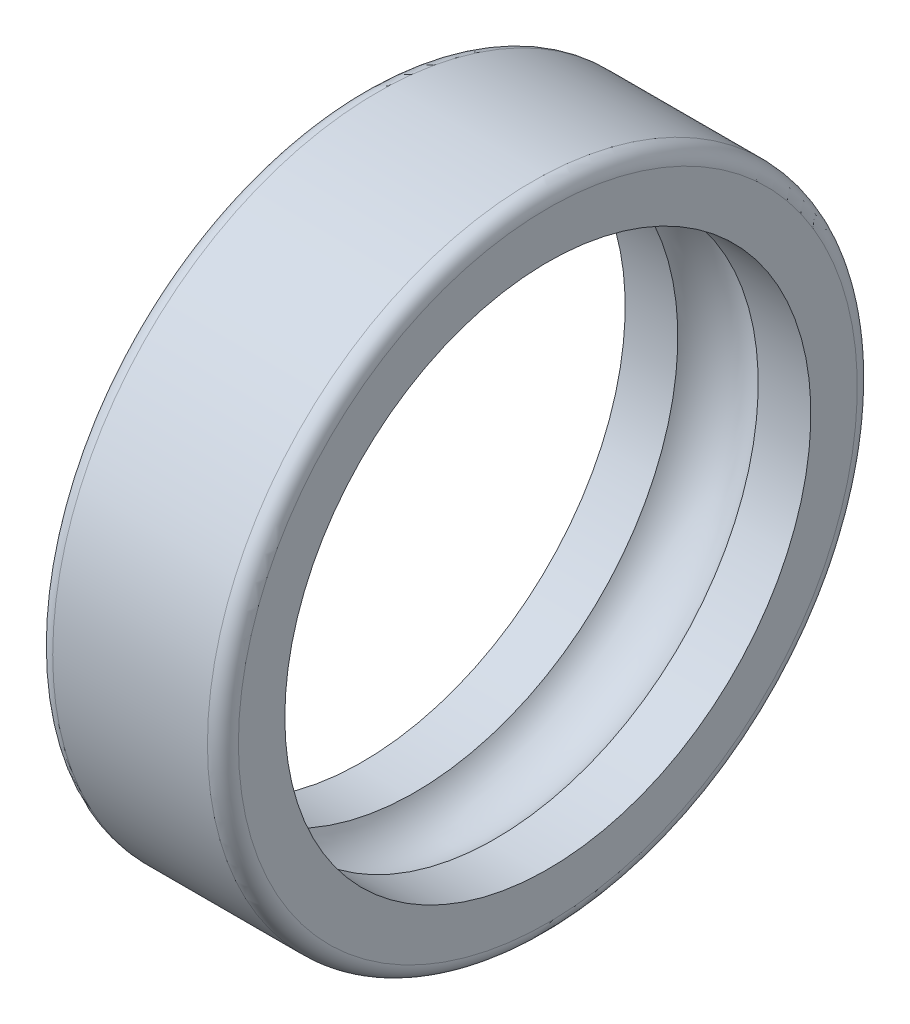
ISO-10303-21;
HEADER;
FILE_DESCRIPTION(('STEP AP214'),'2;1');
FILE_NAME('part.step','',(''),(''),'','','');
FILE_SCHEMA(('AUTOMOTIVE_DESIGN { 1 0 10303 214 1 1 1 1 }'));
ENDSEC;
DATA;
#1=APPLICATION_CONTEXT('core data for automotive mechanical design processes');
#2=APPLICATION_PROTOCOL_DEFINITION('international standard','automotive_design',2000,#1);
#3=PRODUCT_CONTEXT('',#1,'mechanical');
#4=PRODUCT('Part','Part','',(#3));
#5=PRODUCT_RELATED_PRODUCT_CATEGORY('part','',(#4));
#6=PRODUCT_DEFINITION_FORMATION('','',#4);
#7=PRODUCT_DEFINITION_CONTEXT('part definition',#1,'design');
#8=PRODUCT_DEFINITION('design','',#6,#7);
#9=PRODUCT_DEFINITION_SHAPE('','',#8);
#10=(LENGTH_UNIT() NAMED_UNIT(*) SI_UNIT(.MILLI.,.METRE.));
#11=(NAMED_UNIT(*) PLANE_ANGLE_UNIT() SI_UNIT($,.RADIAN.));
#12=(NAMED_UNIT(*) SI_UNIT($,.STERADIAN.) SOLID_ANGLE_UNIT());
#13=UNCERTAINTY_MEASURE_WITH_UNIT(LENGTH_MEASURE(1.E-05),#10,'distance_accuracy_value','');
#14=(GEOMETRIC_REPRESENTATION_CONTEXT(3) GLOBAL_UNCERTAINTY_ASSIGNED_CONTEXT((#13)) GLOBAL_UNIT_ASSIGNED_CONTEXT((#10,
#11,#12)) REPRESENTATION_CONTEXT('',''));
#15=CARTESIAN_POINT('',(0.,0.,0.));
#16=DIRECTION('',(0.,0.,1.));
#17=DIRECTION('',(1.,0.,0.));
#18=AXIS2_PLACEMENT_3D('',#15,#16,#17);
#19=CARTESIAN_POINT('',(-7.,104.5,0.));
#20=DIRECTION('',(1.,0.,0.));
#21=DIRECTION('',(0.,0.,-1.));
#22=AXIS2_PLACEMENT_3D('',#19,#20,#21);
#23=PLANE('',#22);
#24=CARTESIAN_POINT('',(-7.,87.5,0.));
#25=DIRECTION('',(-1.,0.,0.));
#26=DIRECTION('',(0.,0.,1.));
#27=AXIS2_PLACEMENT_3D('',#24,#25,#26);
#28=CIRCLE('',#27,17.);
#29=CARTESIAN_POINT('',(-7.,87.5,17.));
#30=VERTEX_POINT('',#29);
#31=EDGE_CURVE('E59',#30,#30,#28,.T.);
#32=ORIENTED_EDGE('',*,*,#31,.F.);
#33=EDGE_LOOP('',(#32));
#34=FACE_BOUND('',#33,.T.);
#35=CARTESIAN_POINT('',(-7.,87.5,0.));
#36=DIRECTION('',(-1.,0.,0.));
#37=DIRECTION('',(0.,0.,1.));
#38=AXIS2_PLACEMENT_3D('',#35,#36,#37);
#39=CIRCLE('',#38,20.);
#40=CARTESIAN_POINT('',(-7.,87.5,20.));
#41=VERTEX_POINT('',#40);
#42=EDGE_CURVE('E10',#41,#41,#39,.T.);
#43=ORIENTED_EDGE('',*,*,#42,.T.);
#44=EDGE_LOOP('',(#43));
#45=FACE_BOUND('',#44,.T.);
#46=ADVANCED_FACE('F31',(#34,#45),#23,.F.);
#47=CARTESIAN_POINT('',(-6.,87.5,0.));
#48=DIRECTION('',(-1.,0.,0.));
#49=DIRECTION('',(0.,0.,1.));
#50=AXIS2_PLACEMENT_3D('',#47,#48,#49);
#51=TOROIDAL_SURFACE('',#50,20.,1.);
#52=ORIENTED_EDGE('',*,*,#42,.F.);
#53=EDGE_LOOP('',(#52));
#54=FACE_BOUND('',#53,.T.);
#55=CARTESIAN_POINT('',(-6.,87.5,0.));
#56=DIRECTION('',(-1.,0.,0.));
#57=DIRECTION('',(0.,0.,1.));
#58=AXIS2_PLACEMENT_3D('',#55,#56,#57);
#59=CIRCLE('',#58,21.);
#60=CARTESIAN_POINT('',(-6.,87.5,21.));
#61=VERTEX_POINT('',#60);
#62=EDGE_CURVE('E37',#61,#61,#59,.T.);
#63=ORIENTED_EDGE('',*,*,#62,.T.);
#64=EDGE_LOOP('',(#63));
#65=FACE_BOUND('',#64,.T.);
#66=ADVANCED_FACE('F66',(#54,#65),#51,.T.);
#67=CARTESIAN_POINT('',(-11.189264062614,87.5,0.));
#68=DIRECTION('',(-1.,0.,0.));
#69=DIRECTION('',(0.,0.,1.));
#70=AXIS2_PLACEMENT_3D('',#67,#68,#69);
#71=CYLINDRICAL_SURFACE('',#70,21.);
#72=ORIENTED_EDGE('',*,*,#62,.F.);
#73=EDGE_LOOP('',(#72));
#74=FACE_BOUND('',#73,.T.);
#75=CARTESIAN_POINT('',(4.,87.5,0.));
#76=DIRECTION('',(-1.,0.,0.));
#77=DIRECTION('',(0.,0.,1.));
#78=AXIS2_PLACEMENT_3D('',#75,#76,#77);
#79=CIRCLE('',#78,21.);
#80=CARTESIAN_POINT('',(4.,87.5,21.));
#81=VERTEX_POINT('',#80);
#82=EDGE_CURVE('E41',#81,#81,#79,.T.);
#83=ORIENTED_EDGE('',*,*,#82,.T.);
#84=EDGE_LOOP('',(#83));
#85=FACE_BOUND('',#84,.T.);
#86=ADVANCED_FACE('F70',(#74,#85),#71,.T.);
#87=CARTESIAN_POINT('',(4.,87.5,0.));
#88=DIRECTION('',(-1.,0.,0.));
#89=DIRECTION('',(0.,0.,1.));
#90=AXIS2_PLACEMENT_3D('',#87,#88,#89);
#91=TOROIDAL_SURFACE('',#90,20.,1.);
#92=ORIENTED_EDGE('',*,*,#82,.F.);
#93=EDGE_LOOP('',(#92));
#94=FACE_BOUND('',#93,.T.);
#95=CARTESIAN_POINT('',(5.,87.5,0.));
#96=DIRECTION('',(-1.,0.,0.));
#97=DIRECTION('',(0.,0.,1.));
#98=AXIS2_PLACEMENT_3D('',#95,#96,#97);
#99=CIRCLE('',#98,20.);
#100=CARTESIAN_POINT('',(5.,87.5,20.));
#101=VERTEX_POINT('',#100);
#102=EDGE_CURVE('E45',#101,#101,#99,.T.);
#103=ORIENTED_EDGE('',*,*,#102,.T.);
#104=EDGE_LOOP('',(#103));
#105=FACE_BOUND('',#104,.T.);
#106=ADVANCED_FACE('F75',(#94,#105),#91,.T.);
#107=CARTESIAN_POINT('',(5.,104.5,0.));
#108=DIRECTION('',(-1.,0.,0.));
#109=DIRECTION('',(0.,0.,1.));
#110=AXIS2_PLACEMENT_3D('',#107,#108,#109);
#111=PLANE('',#110);
#112=ORIENTED_EDGE('',*,*,#102,.F.);
#113=EDGE_LOOP('',(#112));
#114=FACE_BOUND('',#113,.T.);
#115=CARTESIAN_POINT('',(5.,87.5,0.));
#116=DIRECTION('',(-1.,0.,0.));
#117=DIRECTION('',(0.,0.,1.));
#118=AXIS2_PLACEMENT_3D('',#115,#116,#117);
#119=CIRCLE('',#118,17.);
#120=CARTESIAN_POINT('',(5.,87.5,17.));
#121=VERTEX_POINT('',#120);
#122=EDGE_CURVE('E50',#121,#121,#119,.T.);
#123=ORIENTED_EDGE('',*,*,#122,.T.);
#124=EDGE_LOOP('',(#123));
#125=FACE_BOUND('',#124,.T.);
#126=ADVANCED_FACE('F81',(#114,#125),#111,.F.);
#127=CARTESIAN_POINT('',(-11.189264062614,87.5,0.));
#128=DIRECTION('',(-1.,0.,0.));
#129=DIRECTION('',(0.,0.,1.));
#130=AXIS2_PLACEMENT_3D('',#127,#128,#129);
#131=CYLINDRICAL_SURFACE('',#130,17.);
#132=ORIENTED_EDGE('',*,*,#122,.F.);
#133=EDGE_LOOP('',(#132));
#134=FACE_BOUND('',#133,.T.);
#135=CARTESIAN_POINT('',(1.59807621135333,87.5,0.));
#136=DIRECTION('',(-1.,0.,0.));
#137=DIRECTION('',(0.,0.,1.));
#138=AXIS2_PLACEMENT_3D('',#135,#136,#137);
#139=CIRCLE('',#138,17.);
#140=CARTESIAN_POINT('',(1.59807621135333,87.5,17.));
#141=VERTEX_POINT('',#140);
#142=EDGE_CURVE('E53',#141,#141,#139,.T.);
#143=ORIENTED_EDGE('',*,*,#142,.T.);
#144=EDGE_LOOP('',(#143));
#145=FACE_BOUND('',#144,.T.);
#146=ADVANCED_FACE('F85',(#134,#145),#131,.F.);
#147=CARTESIAN_POINT('',(-0.999999999999992,87.5,0.));
#148=DIRECTION('',(-1.,0.,0.));
#149=DIRECTION('',(0.,0.,1.));
#150=AXIS2_PLACEMENT_3D('',#147,#148,#149);
#151=TOROIDAL_SURFACE('',#150,15.5,3.);
#152=ORIENTED_EDGE('',*,*,#142,.F.);
#153=EDGE_LOOP('',(#152));
#154=FACE_BOUND('',#153,.T.);
#155=CARTESIAN_POINT('',(-3.59807621135332,87.5,0.));
#156=DIRECTION('',(-1.,0.,0.));
#157=DIRECTION('',(0.,0.,1.));
#158=AXIS2_PLACEMENT_3D('',#155,#156,#157);
#159=CIRCLE('',#158,17.);
#160=CARTESIAN_POINT('',(-3.59807621135332,87.5,17.));
#161=VERTEX_POINT('',#160);
#162=EDGE_CURVE('E56',#161,#161,#159,.T.);
#163=ORIENTED_EDGE('',*,*,#162,.T.);
#164=EDGE_LOOP('',(#163));
#165=FACE_BOUND('',#164,.T.);
#166=ADVANCED_FACE('F89',(#154,#165),#151,.F.);
#167=CARTESIAN_POINT('',(-11.189264062614,87.5,0.));
#168=DIRECTION('',(-1.,0.,0.));
#169=DIRECTION('',(0.,0.,1.));
#170=AXIS2_PLACEMENT_3D('',#167,#168,#169);
#171=CYLINDRICAL_SURFACE('',#170,17.);
#172=ORIENTED_EDGE('',*,*,#162,.F.);
#173=EDGE_LOOP('',(#172));
#174=FACE_BOUND('',#173,.T.);
#175=ORIENTED_EDGE('',*,*,#31,.T.);
#176=EDGE_LOOP('',(#175));
#177=FACE_BOUND('',#176,.T.);
#178=ADVANCED_FACE('F63',(#174,#177),#171,.F.);
#179=CLOSED_SHELL('',(#46,#66,#86,#106,#126,#146,#166,#178));
#180=MANIFOLD_SOLID_BREP('B2',#179);
#181=ADVANCED_BREP_SHAPE_REPRESENTATION('',(#18,#180),#14);
#182=SHAPE_DEFINITION_REPRESENTATION(#9,#181);
ENDSEC;
END-ISO-10303-21;
